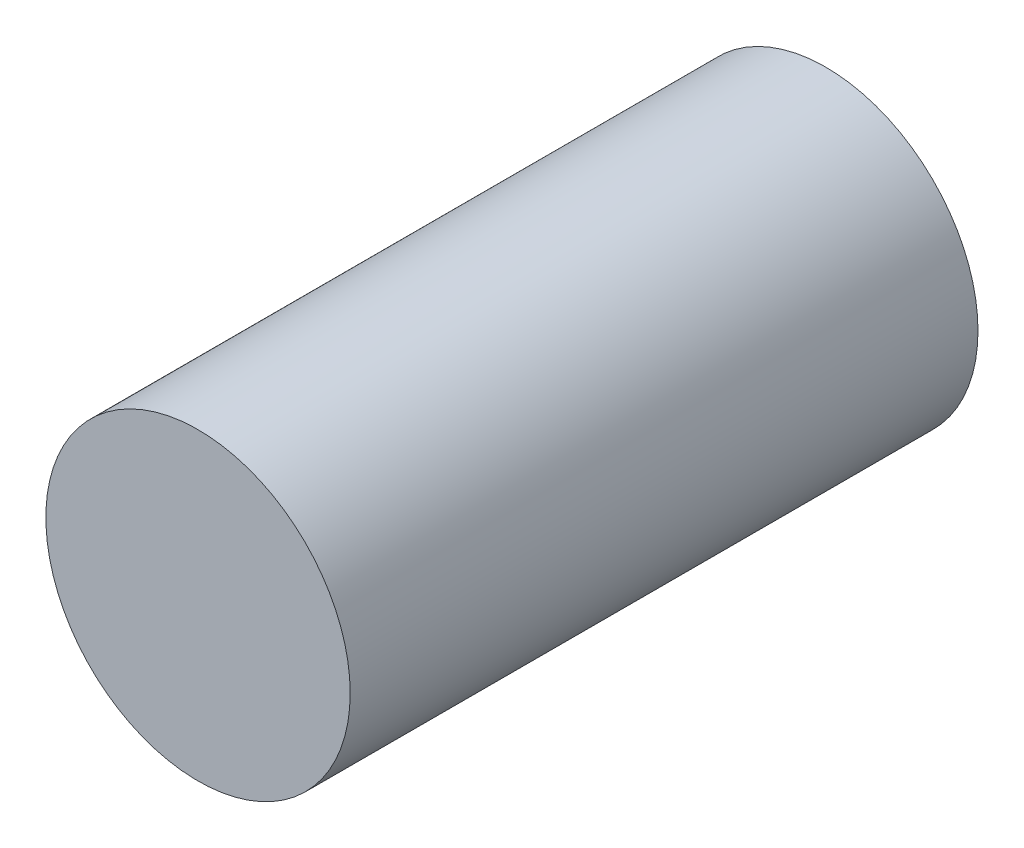
ISO-10303-21;
HEADER;
FILE_DESCRIPTION(('STEP AP214'),'2;1');
FILE_NAME('part.step','',(''),(''),'','','');
FILE_SCHEMA(('AUTOMOTIVE_DESIGN { 1 0 10303 214 1 1 1 1 }'));
ENDSEC;
DATA;
#1=APPLICATION_CONTEXT('core data for automotive mechanical design processes');
#2=APPLICATION_PROTOCOL_DEFINITION('international standard','automotive_design',2000,#1);
#3=PRODUCT_CONTEXT('',#1,'mechanical');
#4=PRODUCT('Part','Part','',(#3));
#5=PRODUCT_RELATED_PRODUCT_CATEGORY('part','',(#4));
#6=PRODUCT_DEFINITION_FORMATION('','',#4);
#7=PRODUCT_DEFINITION_CONTEXT('part definition',#1,'design');
#8=PRODUCT_DEFINITION('design','',#6,#7);
#9=PRODUCT_DEFINITION_SHAPE('','',#8);
#10=(LENGTH_UNIT() NAMED_UNIT(*) SI_UNIT(.MILLI.,.METRE.));
#11=(NAMED_UNIT(*) PLANE_ANGLE_UNIT() SI_UNIT($,.RADIAN.));
#12=(NAMED_UNIT(*) SI_UNIT($,.STERADIAN.) SOLID_ANGLE_UNIT());
#13=UNCERTAINTY_MEASURE_WITH_UNIT(LENGTH_MEASURE(1.E-05),#10,'distance_accuracy_value','');
#14=(GEOMETRIC_REPRESENTATION_CONTEXT(3) GLOBAL_UNCERTAINTY_ASSIGNED_CONTEXT((#13)) GLOBAL_UNIT_ASSIGNED_CONTEXT((#10,
#11,#12)) REPRESENTATION_CONTEXT('',''));
#15=CARTESIAN_POINT('',(0.,0.,0.));
#16=DIRECTION('',(0.,0.,1.));
#17=DIRECTION('',(1.,0.,0.));
#18=AXIS2_PLACEMENT_3D('',#15,#16,#17);
#19=CARTESIAN_POINT('',(-0.800000905990601,-25.0749988555908,-1.6000018119812));
#20=DIRECTION('',(0.,0.,1.));
#21=DIRECTION('',(1.,0.,0.));
#22=AXIS2_PLACEMENT_3D('',#19,#20,#21);
#23=PLANE('',#22);
#24=CARTESIAN_POINT('',(5.96046447753906E-08,0.,-1.6000018119812));
#25=DIRECTION('',(0.,0.,1.));
#26=DIRECTION('',(1.,0.,0.));
#27=AXIS2_PLACEMENT_3D('',#24,#25,#26);
#28=CIRCLE('',#27,3.99949169158936);
#29=CARTESIAN_POINT('',(3.99949175119401,0.,-1.6000018119812));
#30=VERTEX_POINT('',#29);
#31=EDGE_CURVE('E22',#30,#30,#28,.F.);
#32=ORIENTED_EDGE('',*,*,#31,.F.);
#33=EDGE_LOOP('',(#32));
#34=FACE_BOUND('',#33,.T.);
#35=ADVANCED_FACE('F15',(#34),#23,.T.);
#36=CARTESIAN_POINT('',(-0.800000905990601,-25.0749988555908,-18.1000018119812));
#37=DIRECTION('',(0.,0.,1.));
#38=DIRECTION('',(1.,0.,0.));
#39=AXIS2_PLACEMENT_3D('',#36,#37,#38);
#40=PLANE('',#39);
#41=CARTESIAN_POINT('',(5.96046447753906E-08,0.,-18.1000018119812));
#42=DIRECTION('',(0.,0.,1.));
#43=DIRECTION('',(1.,0.,0.));
#44=AXIS2_PLACEMENT_3D('',#41,#42,#43);
#45=CIRCLE('',#44,3.99949169158936);
#46=CARTESIAN_POINT('',(3.99949175119401,0.,-18.1000018119812));
#47=VERTEX_POINT('',#46);
#48=EDGE_CURVE('E10',#47,#47,#45,.T.);
#49=ORIENTED_EDGE('',*,*,#48,.F.);
#50=EDGE_LOOP('',(#49));
#51=FACE_BOUND('',#50,.T.);
#52=ADVANCED_FACE('F34',(#51),#40,.F.);
#53=CARTESIAN_POINT('',(5.96046447753906E-08,0.,-18.1000018119812));
#54=DIRECTION('',(0.,0.,1.));
#55=DIRECTION('',(1.,0.,0.));
#56=AXIS2_PLACEMENT_3D('',#53,#54,#55);
#57=CYLINDRICAL_SURFACE('',#56,3.99949169158936);
#58=ORIENTED_EDGE('',*,*,#48,.T.);
#59=EDGE_LOOP('',(#58));
#60=FACE_BOUND('',#59,.T.);
#61=ORIENTED_EDGE('',*,*,#31,.T.);
#62=EDGE_LOOP('',(#61));
#63=FACE_BOUND('',#62,.T.);
#64=ADVANCED_FACE('F31',(#60,#63),#57,.T.);
#65=CLOSED_SHELL('',(#35,#52,#64));
#66=MANIFOLD_SOLID_BREP('B1',#65);
#67=ADVANCED_BREP_SHAPE_REPRESENTATION('',(#18,#66),#14);
#68=SHAPE_DEFINITION_REPRESENTATION(#9,#67);
ENDSEC;
END-ISO-10303-21;
